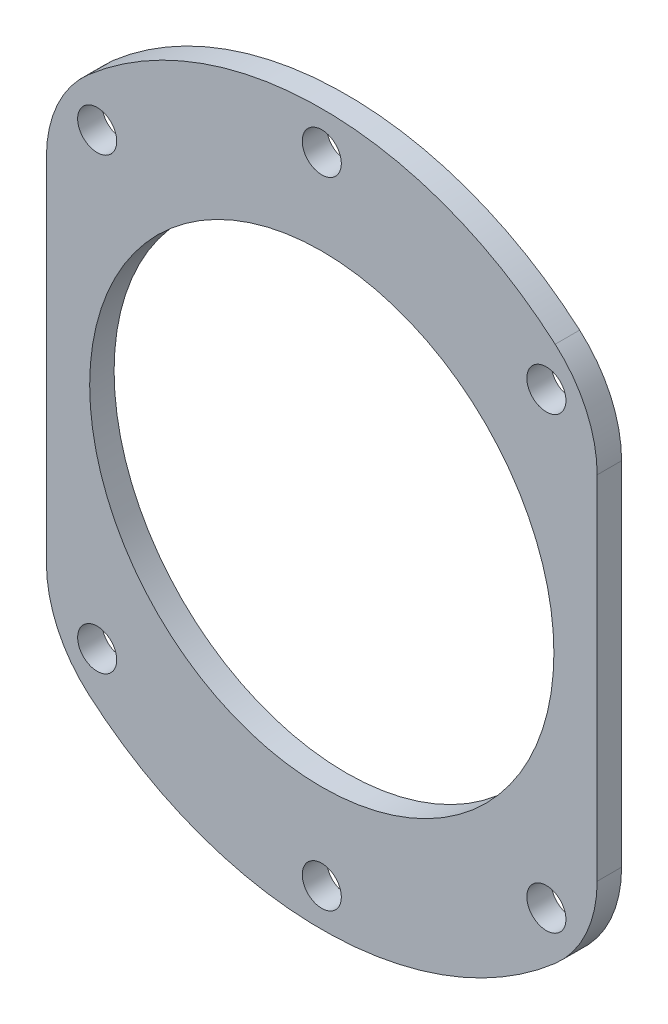
ISO-10303-21;
HEADER;
FILE_DESCRIPTION(('STEP AP214'),'2;1');
FILE_NAME('part.step','',(''),(''),'','','');
FILE_SCHEMA(('AUTOMOTIVE_DESIGN { 1 0 10303 214 1 1 1 1 }'));
ENDSEC;
DATA;
#1=APPLICATION_CONTEXT('core data for automotive mechanical design processes');
#2=APPLICATION_PROTOCOL_DEFINITION('international standard','automotive_design',2000,#1);
#3=PRODUCT_CONTEXT('',#1,'mechanical');
#4=PRODUCT('Part','Part','',(#3));
#5=PRODUCT_RELATED_PRODUCT_CATEGORY('part','',(#4));
#6=PRODUCT_DEFINITION_FORMATION('','',#4);
#7=PRODUCT_DEFINITION_CONTEXT('part definition',#1,'design');
#8=PRODUCT_DEFINITION('design','',#6,#7);
#9=PRODUCT_DEFINITION_SHAPE('','',#8);
#10=(LENGTH_UNIT() NAMED_UNIT(*) SI_UNIT(.MILLI.,.METRE.));
#11=(NAMED_UNIT(*) PLANE_ANGLE_UNIT() SI_UNIT($,.RADIAN.));
#12=(NAMED_UNIT(*) SI_UNIT($,.STERADIAN.) SOLID_ANGLE_UNIT());
#13=UNCERTAINTY_MEASURE_WITH_UNIT(LENGTH_MEASURE(1.E-05),#10,'distance_accuracy_value','');
#14=(GEOMETRIC_REPRESENTATION_CONTEXT(3) GLOBAL_UNCERTAINTY_ASSIGNED_CONTEXT((#13)) GLOBAL_UNIT_ASSIGNED_CONTEXT((#10,
#11,#12)) REPRESENTATION_CONTEXT('',''));
#15=CARTESIAN_POINT('',(0.,0.,0.));
#16=DIRECTION('',(0.,0.,1.));
#17=DIRECTION('',(1.,0.,0.));
#18=AXIS2_PLACEMENT_3D('',#15,#16,#17);
#19=CARTESIAN_POINT('',(-58.8,0.,2.));
#20=DIRECTION('',(0.,0.,1.));
#21=DIRECTION('',(1.,0.,0.));
#22=AXIS2_PLACEMENT_3D('',#19,#20,#21);
#23=PLANE('',#22);
#24=CARTESIAN_POINT('',(-58.8,26.,2.));
#25=DIRECTION('',(0.,0.,1.));
#26=DIRECTION('',(1.,0.,0.));
#27=AXIS2_PLACEMENT_3D('',#24,#25,#26);
#28=CIRCLE('',#27,1.6);
#29=CARTESIAN_POINT('',(-57.2,26.,2.));
#30=VERTEX_POINT('',#29);
#31=EDGE_CURVE('E259',#30,#30,#28,.T.);
#32=ORIENTED_EDGE('',*,*,#31,.F.);
#33=EDGE_LOOP('',(#32));
#34=FACE_BOUND('',#33,.T.);
#35=CARTESIAN_POINT('',(-77.1847763108502,18.3847763108502,2.));
#36=DIRECTION('',(0.,0.,1.));
#37=DIRECTION('',(1.,0.,0.));
#38=AXIS2_PLACEMENT_3D('',#35,#36,#37);
#39=CIRCLE('',#38,1.6);
#40=CARTESIAN_POINT('',(-75.5847763108502,18.3847763108502,2.));
#41=VERTEX_POINT('',#40);
#42=EDGE_CURVE('E233',#41,#41,#39,.T.);
#43=ORIENTED_EDGE('',*,*,#42,.F.);
#44=EDGE_LOOP('',(#43));
#45=FACE_BOUND('',#44,.T.);
#46=CARTESIAN_POINT('',(-77.1847763108502,-18.3847763108502,2.));
#47=DIRECTION('',(0.,0.,1.));
#48=DIRECTION('',(1.,0.,0.));
#49=AXIS2_PLACEMENT_3D('',#46,#47,#48);
#50=CIRCLE('',#49,1.6);
#51=CARTESIAN_POINT('',(-75.5847763108502,-18.3847763108502,2.));
#52=VERTEX_POINT('',#51);
#53=EDGE_CURVE('E232',#52,#52,#50,.T.);
#54=ORIENTED_EDGE('',*,*,#53,.F.);
#55=EDGE_LOOP('',(#54));
#56=FACE_BOUND('',#55,.T.);
#57=CARTESIAN_POINT('',(-58.8,-26.,2.));
#58=DIRECTION('',(0.,0.,1.));
#59=DIRECTION('',(1.,0.,0.));
#60=AXIS2_PLACEMENT_3D('',#57,#58,#59);
#61=CIRCLE('',#60,1.6);
#62=CARTESIAN_POINT('',(-57.2,-26.,2.));
#63=VERTEX_POINT('',#62);
#64=EDGE_CURVE('E241',#63,#63,#61,.T.);
#65=ORIENTED_EDGE('',*,*,#64,.F.);
#66=EDGE_LOOP('',(#65));
#67=FACE_BOUND('',#66,.T.);
#68=CARTESIAN_POINT('',(-40.4152236891498,-18.3847763108502,2.));
#69=DIRECTION('',(0.,0.,1.));
#70=DIRECTION('',(1.,0.,0.));
#71=AXIS2_PLACEMENT_3D('',#68,#69,#70);
#72=CIRCLE('',#71,1.6);
#73=CARTESIAN_POINT('',(-38.8152236891498,-18.3847763108502,2.));
#74=VERTEX_POINT('',#73);
#75=EDGE_CURVE('E248',#74,#74,#72,.T.);
#76=ORIENTED_EDGE('',*,*,#75,.F.);
#77=EDGE_LOOP('',(#76));
#78=FACE_BOUND('',#77,.T.);
#79=CARTESIAN_POINT('',(-40.4152236891497,18.3847763108502,2.));
#80=DIRECTION('',(0.,0.,1.));
#81=DIRECTION('',(1.,0.,0.));
#82=AXIS2_PLACEMENT_3D('',#79,#80,#81);
#83=CIRCLE('',#82,1.59999999999999);
#84=CARTESIAN_POINT('',(-38.8152236891498,18.3847763108502,2.));
#85=VERTEX_POINT('',#84);
#86=EDGE_CURVE('E256',#85,#85,#83,.T.);
#87=ORIENTED_EDGE('',*,*,#86,.F.);
#88=EDGE_LOOP('',(#87));
#89=FACE_BOUND('',#88,.T.);
#90=DIRECTION('',(0.,-1.,0.));
#91=VECTOR('',#90,1.);
#92=CARTESIAN_POINT('',(-81.3413600290393,18.4037248414888,2.));
#93=LINE('',#92,#91);
#94=CARTESIAN_POINT('',(-81.3413600290393,14.4057033365961,2.));
#95=VERTEX_POINT('',#94);
#96=CARTESIAN_POINT('',(-81.3413600290393,-14.4057033365961,2.));
#97=VERTEX_POINT('',#96);
#98=EDGE_CURVE('E158',#95,#97,#93,.T.);
#99=ORIENTED_EDGE('',*,*,#98,.T.);
#100=CARTESIAN_POINT('',(-71.3413600290393,-14.4057033365961,2.));
#101=DIRECTION('',(0.,0.,1.));
#102=DIRECTION('',(1.,0.,0.));
#103=AXIS2_PLACEMENT_3D('',#100,#101,#102);
#104=CIRCLE('',#103,10.);
#105=CARTESIAN_POINT('',(-77.9075171123059,-21.9479563924056,2.));
#106=VERTEX_POINT('',#105);
#107=EDGE_CURVE('E187',#97,#106,#104,.T.);
#108=ORIENTED_EDGE('',*,*,#107,.T.);
#109=CARTESIAN_POINT('',(-58.8,0.,2.));
#110=DIRECTION('',(0.,0.,1.));
#111=DIRECTION('',(1.,0.,0.));
#112=AXIS2_PLACEMENT_3D('',#109,#110,#111);
#113=CIRCLE('',#112,29.1);
#114=CARTESIAN_POINT('',(-39.6924828876942,-21.9479563924057,2.));
#115=VERTEX_POINT('',#114);
#116=EDGE_CURVE('E134',#106,#115,#113,.T.);
#117=ORIENTED_EDGE('',*,*,#116,.T.);
#118=CARTESIAN_POINT('',(-46.2586399709608,-14.4057033365962,2.));
#119=DIRECTION('',(0.,0.,1.));
#120=DIRECTION('',(1.,0.,0.));
#121=AXIS2_PLACEMENT_3D('',#118,#119,#120);
#122=CIRCLE('',#121,10.);
#123=CARTESIAN_POINT('',(-36.2586399709608,-14.4057033365962,2.));
#124=VERTEX_POINT('',#123);
#125=EDGE_CURVE('E181',#115,#124,#122,.T.);
#126=ORIENTED_EDGE('',*,*,#125,.T.);
#127=DIRECTION('',(0.,1.,0.));
#128=VECTOR('',#127,1.);
#129=CARTESIAN_POINT('',(-36.2586399709608,18.4037248414888,2.));
#130=LINE('',#129,#128);
#131=CARTESIAN_POINT('',(-36.2586399709608,14.4057033365962,2.));
#132=VERTEX_POINT('',#131);
#133=EDGE_CURVE('E200',#124,#132,#130,.T.);
#134=ORIENTED_EDGE('',*,*,#133,.T.);
#135=CARTESIAN_POINT('',(-46.2586399709608,14.4057033365962,2.));
#136=DIRECTION('',(0.,0.,1.));
#137=DIRECTION('',(1.,0.,0.));
#138=AXIS2_PLACEMENT_3D('',#135,#136,#137);
#139=CIRCLE('',#138,10.);
#140=CARTESIAN_POINT('',(-39.6924828876942,21.9479563924057,2.));
#141=VERTEX_POINT('',#140);
#142=EDGE_CURVE('E68',#132,#141,#139,.T.);
#143=ORIENTED_EDGE('',*,*,#142,.T.);
#144=CARTESIAN_POINT('',(-58.8,0.,2.));
#145=DIRECTION('',(0.,0.,1.));
#146=DIRECTION('',(1.,0.,0.));
#147=AXIS2_PLACEMENT_3D('',#144,#145,#146);
#148=CIRCLE('',#147,29.1);
#149=CARTESIAN_POINT('',(-77.9075171123059,21.9479563924056,2.));
#150=VERTEX_POINT('',#149);
#151=EDGE_CURVE('E207',#141,#150,#148,.T.);
#152=ORIENTED_EDGE('',*,*,#151,.T.);
#153=CARTESIAN_POINT('',(-71.3413600290393,14.4057033365961,2.));
#154=DIRECTION('',(0.,0.,1.));
#155=DIRECTION('',(1.,0.,0.));
#156=AXIS2_PLACEMENT_3D('',#153,#154,#155);
#157=CIRCLE('',#156,10.);
#158=EDGE_CURVE('E184',#150,#95,#157,.T.);
#159=ORIENTED_EDGE('',*,*,#158,.T.);
#160=EDGE_LOOP('',(#99,#108,#117,#126,#134,#143,#152,#159));
#161=FACE_BOUND('',#160,.T.);
#162=CARTESIAN_POINT('',(-58.8,0.,2.));
#163=DIRECTION('',(0.,0.,1.));
#164=DIRECTION('',(1.,0.,0.));
#165=AXIS2_PLACEMENT_3D('',#162,#163,#164);
#166=CIRCLE('',#165,19.);
#167=CARTESIAN_POINT('',(-39.8,0.,2.));
#168=VERTEX_POINT('',#167);
#169=EDGE_CURVE('E145',#168,#168,#166,.T.);
#170=ORIENTED_EDGE('',*,*,#169,.F.);
#171=EDGE_LOOP('',(#170));
#172=FACE_BOUND('',#171,.T.);
#173=ADVANCED_FACE('F45',(#34,#45,#56,#67,#78,#89,#161,#172),#23,.T.);
#174=CARTESIAN_POINT('',(-58.8,0.,0.));
#175=DIRECTION('',(0.,0.,1.));
#176=DIRECTION('',(1.,0.,0.));
#177=AXIS2_PLACEMENT_3D('',#174,#175,#176);
#178=PLANE('',#177);
#179=CARTESIAN_POINT('',(-58.8,26.,0.));
#180=DIRECTION('',(0.,0.,1.));
#181=DIRECTION('',(1.,0.,0.));
#182=AXIS2_PLACEMENT_3D('',#179,#180,#181);
#183=CIRCLE('',#182,1.6);
#184=CARTESIAN_POINT('',(-57.2,26.,0.));
#185=VERTEX_POINT('',#184);
#186=EDGE_CURVE('E226',#185,#185,#183,.T.);
#187=ORIENTED_EDGE('',*,*,#186,.T.);
#188=EDGE_LOOP('',(#187));
#189=FACE_BOUND('',#188,.T.);
#190=CARTESIAN_POINT('',(-77.1847763108502,18.3847763108502,0.));
#191=DIRECTION('',(0.,0.,1.));
#192=DIRECTION('',(1.,0.,0.));
#193=AXIS2_PLACEMENT_3D('',#190,#191,#192);
#194=CIRCLE('',#193,1.6);
#195=CARTESIAN_POINT('',(-75.5847763108502,18.3847763108502,0.));
#196=VERTEX_POINT('',#195);
#197=EDGE_CURVE('E260',#196,#196,#194,.T.);
#198=ORIENTED_EDGE('',*,*,#197,.T.);
#199=EDGE_LOOP('',(#198));
#200=FACE_BOUND('',#199,.T.);
#201=CARTESIAN_POINT('',(-77.1847763108502,-18.3847763108502,0.));
#202=DIRECTION('',(0.,0.,1.));
#203=DIRECTION('',(1.,0.,0.));
#204=AXIS2_PLACEMENT_3D('',#201,#202,#203);
#205=CIRCLE('',#204,1.6);
#206=CARTESIAN_POINT('',(-75.5847763108502,-18.3847763108502,0.));
#207=VERTEX_POINT('',#206);
#208=EDGE_CURVE('E228',#207,#207,#205,.T.);
#209=ORIENTED_EDGE('',*,*,#208,.T.);
#210=EDGE_LOOP('',(#209));
#211=FACE_BOUND('',#210,.T.);
#212=CARTESIAN_POINT('',(-58.8,-26.,0.));
#213=DIRECTION('',(0.,0.,1.));
#214=DIRECTION('',(1.,0.,0.));
#215=AXIS2_PLACEMENT_3D('',#212,#213,#214);
#216=CIRCLE('',#215,1.6);
#217=CARTESIAN_POINT('',(-57.2,-26.,0.));
#218=VERTEX_POINT('',#217);
#219=EDGE_CURVE('E237',#218,#218,#216,.T.);
#220=ORIENTED_EDGE('',*,*,#219,.T.);
#221=EDGE_LOOP('',(#220));
#222=FACE_BOUND('',#221,.T.);
#223=CARTESIAN_POINT('',(-40.4152236891498,-18.3847763108502,0.));
#224=DIRECTION('',(0.,0.,1.));
#225=DIRECTION('',(1.,0.,0.));
#226=AXIS2_PLACEMENT_3D('',#223,#224,#225);
#227=CIRCLE('',#226,1.6);
#228=CARTESIAN_POINT('',(-38.8152236891498,-18.3847763108502,0.));
#229=VERTEX_POINT('',#228);
#230=EDGE_CURVE('E245',#229,#229,#227,.T.);
#231=ORIENTED_EDGE('',*,*,#230,.T.);
#232=EDGE_LOOP('',(#231));
#233=FACE_BOUND('',#232,.T.);
#234=CARTESIAN_POINT('',(-40.4152236891497,18.3847763108502,0.));
#235=DIRECTION('',(0.,0.,1.));
#236=DIRECTION('',(1.,0.,0.));
#237=AXIS2_PLACEMENT_3D('',#234,#235,#236);
#238=CIRCLE('',#237,1.59999999999999);
#239=CARTESIAN_POINT('',(-38.8152236891498,18.3847763108502,0.));
#240=VERTEX_POINT('',#239);
#241=EDGE_CURVE('E252',#240,#240,#238,.T.);
#242=ORIENTED_EDGE('',*,*,#241,.T.);
#243=EDGE_LOOP('',(#242));
#244=FACE_BOUND('',#243,.T.);
#245=CARTESIAN_POINT('',(-58.8,0.,0.));
#246=DIRECTION('',(0.,0.,1.));
#247=DIRECTION('',(1.,0.,0.));
#248=AXIS2_PLACEMENT_3D('',#245,#246,#247);
#249=CIRCLE('',#248,29.1);
#250=CARTESIAN_POINT('',(-77.9075171123059,-21.9479563924056,0.));
#251=VERTEX_POINT('',#250);
#252=CARTESIAN_POINT('',(-39.6924828876942,-21.9479563924057,0.));
#253=VERTEX_POINT('',#252);
#254=EDGE_CURVE('E131',#251,#253,#249,.T.);
#255=ORIENTED_EDGE('',*,*,#254,.F.);
#256=CARTESIAN_POINT('',(-71.3413600290393,-14.4057033365961,0.));
#257=DIRECTION('',(0.,0.,1.));
#258=DIRECTION('',(1.,0.,0.));
#259=AXIS2_PLACEMENT_3D('',#256,#257,#258);
#260=CIRCLE('',#259,10.);
#261=CARTESIAN_POINT('',(-81.3413600290393,-14.4057033365961,0.));
#262=VERTEX_POINT('',#261);
#263=EDGE_CURVE('E113',#251,#262,#260,.F.);
#264=ORIENTED_EDGE('',*,*,#263,.T.);
#265=DIRECTION('',(0.,-1.,0.));
#266=VECTOR('',#265,1.);
#267=CARTESIAN_POINT('',(-81.3413600290393,18.4037248414888,0.));
#268=LINE('',#267,#266);
#269=CARTESIAN_POINT('',(-81.3413600290393,14.4057033365961,0.));
#270=VERTEX_POINT('',#269);
#271=EDGE_CURVE('E163',#270,#262,#268,.T.);
#272=ORIENTED_EDGE('',*,*,#271,.F.);
#273=CARTESIAN_POINT('',(-71.3413600290393,14.4057033365961,0.));
#274=DIRECTION('',(0.,0.,1.));
#275=DIRECTION('',(1.,0.,0.));
#276=AXIS2_PLACEMENT_3D('',#273,#274,#275);
#277=CIRCLE('',#276,10.);
#278=CARTESIAN_POINT('',(-77.9075171123059,21.9479563924056,0.));
#279=VERTEX_POINT('',#278);
#280=EDGE_CURVE('E125',#270,#279,#277,.F.);
#281=ORIENTED_EDGE('',*,*,#280,.T.);
#282=CARTESIAN_POINT('',(-58.8,0.,0.));
#283=DIRECTION('',(0.,0.,1.));
#284=DIRECTION('',(1.,0.,0.));
#285=AXIS2_PLACEMENT_3D('',#282,#283,#284);
#286=CIRCLE('',#285,29.1);
#287=CARTESIAN_POINT('',(-39.6924828876942,21.9479563924057,0.));
#288=VERTEX_POINT('',#287);
#289=EDGE_CURVE('E151',#288,#279,#286,.T.);
#290=ORIENTED_EDGE('',*,*,#289,.F.);
#291=CARTESIAN_POINT('',(-46.2586399709608,14.4057033365962,0.));
#292=DIRECTION('',(0.,0.,1.));
#293=DIRECTION('',(1.,0.,0.));
#294=AXIS2_PLACEMENT_3D('',#291,#292,#293);
#295=CIRCLE('',#294,10.);
#296=CARTESIAN_POINT('',(-36.2586399709608,14.4057033365962,0.));
#297=VERTEX_POINT('',#296);
#298=EDGE_CURVE('E136',#288,#297,#295,.F.);
#299=ORIENTED_EDGE('',*,*,#298,.T.);
#300=DIRECTION('',(0.,1.,0.));
#301=VECTOR('',#300,1.);
#302=CARTESIAN_POINT('',(-36.2586399709608,18.4037248414888,0.));
#303=LINE('',#302,#301);
#304=CARTESIAN_POINT('',(-36.2586399709608,-14.4057033365962,0.));
#305=VERTEX_POINT('',#304);
#306=EDGE_CURVE('E144',#305,#297,#303,.T.);
#307=ORIENTED_EDGE('',*,*,#306,.F.);
#308=CARTESIAN_POINT('',(-46.2586399709608,-14.4057033365962,0.));
#309=DIRECTION('',(0.,0.,1.));
#310=DIRECTION('',(1.,0.,0.));
#311=AXIS2_PLACEMENT_3D('',#308,#309,#310);
#312=CIRCLE('',#311,10.);
#313=EDGE_CURVE('E142',#305,#253,#312,.F.);
#314=ORIENTED_EDGE('',*,*,#313,.T.);
#315=EDGE_LOOP('',(#255,#264,#272,#281,#290,#299,#307,#314));
#316=FACE_BOUND('',#315,.T.);
#317=CARTESIAN_POINT('',(-58.8,0.,0.));
#318=DIRECTION('',(0.,0.,1.));
#319=DIRECTION('',(1.,0.,0.));
#320=AXIS2_PLACEMENT_3D('',#317,#318,#319);
#321=CIRCLE('',#320,19.);
#322=CARTESIAN_POINT('',(-39.8,0.,0.));
#323=VERTEX_POINT('',#322);
#324=EDGE_CURVE('E155',#323,#323,#321,.T.);
#325=ORIENTED_EDGE('',*,*,#324,.T.);
#326=EDGE_LOOP('',(#325));
#327=FACE_BOUND('',#326,.T.);
#328=ADVANCED_FACE('F139',(#189,#200,#211,#222,#233,#244,#316,#327),#178,.F.);
#329=CARTESIAN_POINT('',(-58.8,0.,2.));
#330=DIRECTION('',(0.,0.,-1.));
#331=DIRECTION('',(-1.,0.,0.));
#332=AXIS2_PLACEMENT_3D('',#329,#330,#331);
#333=CYLINDRICAL_SURFACE('',#332,29.1);
#334=ORIENTED_EDGE('',*,*,#116,.F.);
#335=DIRECTION('',(0.,0.,-1.));
#336=VECTOR('',#335,1.);
#337=CARTESIAN_POINT('',(-77.9075171123059,-21.9479563924056,2.));
#338=LINE('',#337,#336);
#339=EDGE_CURVE('E117',#106,#251,#338,.T.);
#340=ORIENTED_EDGE('',*,*,#339,.T.);
#341=ORIENTED_EDGE('',*,*,#254,.T.);
#342=DIRECTION('',(0.,0.,-1.));
#343=VECTOR('',#342,1.);
#344=CARTESIAN_POINT('',(-39.6924828876942,-21.9479563924057,2.));
#345=LINE('',#344,#343);
#346=EDGE_CURVE('E137',#253,#115,#345,.F.);
#347=ORIENTED_EDGE('',*,*,#346,.T.);
#348=EDGE_LOOP('',(#334,#340,#341,#347));
#349=FACE_BOUND('',#348,.T.);
#350=ADVANCED_FACE('F130',(#349),#333,.T.);
#351=CARTESIAN_POINT('',(-36.2586399709608,18.4037248414888,2.));
#352=DIRECTION('',(-1.,0.,0.));
#353=DIRECTION('',(0.,0.,1.));
#354=AXIS2_PLACEMENT_3D('',#351,#352,#353);
#355=PLANE('',#354);
#356=ORIENTED_EDGE('',*,*,#133,.F.);
#357=DIRECTION('',(0.,0.,-1.));
#358=VECTOR('',#357,1.);
#359=CARTESIAN_POINT('',(-36.2586399709608,-14.4057033365962,2.));
#360=LINE('',#359,#358);
#361=EDGE_CURVE('E11',#124,#305,#360,.T.);
#362=ORIENTED_EDGE('',*,*,#361,.T.);
#363=ORIENTED_EDGE('',*,*,#306,.T.);
#364=DIRECTION('',(0.,0.,-1.));
#365=VECTOR('',#364,1.);
#366=CARTESIAN_POINT('',(-36.2586399709608,14.4057033365962,2.));
#367=LINE('',#366,#365);
#368=EDGE_CURVE('E54',#297,#132,#367,.F.);
#369=ORIENTED_EDGE('',*,*,#368,.T.);
#370=EDGE_LOOP('',(#356,#362,#363,#369));
#371=FACE_BOUND('',#370,.T.);
#372=ADVANCED_FACE('F199',(#371),#355,.F.);
#373=CARTESIAN_POINT('',(-58.8,0.,2.));
#374=DIRECTION('',(0.,0.,-1.));
#375=DIRECTION('',(-1.,0.,0.));
#376=AXIS2_PLACEMENT_3D('',#373,#374,#375);
#377=CYLINDRICAL_SURFACE('',#376,29.1);
#378=ORIENTED_EDGE('',*,*,#289,.T.);
#379=DIRECTION('',(0.,0.,-1.));
#380=VECTOR('',#379,1.);
#381=CARTESIAN_POINT('',(-77.9075171123059,21.9479563924056,2.));
#382=LINE('',#381,#380);
#383=EDGE_CURVE('E61',#279,#150,#382,.F.);
#384=ORIENTED_EDGE('',*,*,#383,.T.);
#385=ORIENTED_EDGE('',*,*,#151,.F.);
#386=DIRECTION('',(0.,0.,-1.));
#387=VECTOR('',#386,1.);
#388=CARTESIAN_POINT('',(-39.6924828876942,21.9479563924057,2.));
#389=LINE('',#388,#387);
#390=EDGE_CURVE('E190',#141,#288,#389,.T.);
#391=ORIENTED_EDGE('',*,*,#390,.T.);
#392=EDGE_LOOP('',(#378,#384,#385,#391));
#393=FACE_BOUND('',#392,.T.);
#394=ADVANCED_FACE('F211',(#393),#377,.T.);
#395=CARTESIAN_POINT('',(-81.3413600290393,18.4037248414888,2.));
#396=DIRECTION('',(1.,0.,0.));
#397=DIRECTION('',(0.,0.,-1.));
#398=AXIS2_PLACEMENT_3D('',#395,#396,#397);
#399=PLANE('',#398);
#400=ORIENTED_EDGE('',*,*,#271,.T.);
#401=DIRECTION('',(0.,0.,-1.));
#402=VECTOR('',#401,1.);
#403=CARTESIAN_POINT('',(-81.3413600290393,-14.4057033365961,2.));
#404=LINE('',#403,#402);
#405=EDGE_CURVE('E118',#262,#97,#404,.F.);
#406=ORIENTED_EDGE('',*,*,#405,.T.);
#407=ORIENTED_EDGE('',*,*,#98,.F.);
#408=DIRECTION('',(0.,0.,-1.));
#409=VECTOR('',#408,1.);
#410=CARTESIAN_POINT('',(-81.3413600290393,14.4057033365961,2.));
#411=LINE('',#410,#409);
#412=EDGE_CURVE('E124',#95,#270,#411,.T.);
#413=ORIENTED_EDGE('',*,*,#412,.T.);
#414=EDGE_LOOP('',(#400,#406,#407,#413));
#415=FACE_BOUND('',#414,.T.);
#416=ADVANCED_FACE('F218',(#415),#399,.F.);
#417=CARTESIAN_POINT('',(-58.8,0.,2.));
#418=DIRECTION('',(0.,0.,-1.));
#419=DIRECTION('',(-1.,0.,0.));
#420=AXIS2_PLACEMENT_3D('',#417,#418,#419);
#421=CYLINDRICAL_SURFACE('',#420,19.);
#422=ORIENTED_EDGE('',*,*,#169,.T.);
#423=EDGE_LOOP('',(#422));
#424=FACE_BOUND('',#423,.T.);
#425=ORIENTED_EDGE('',*,*,#324,.F.);
#426=EDGE_LOOP('',(#425));
#427=FACE_BOUND('',#426,.T.);
#428=ADVANCED_FACE('F299',(#424,#427),#421,.F.);
#429=CARTESIAN_POINT('',(-40.4152236891497,18.3847763108502,0.));
#430=DIRECTION('',(0.,0.,1.));
#431=DIRECTION('',(1.,0.,0.));
#432=AXIS2_PLACEMENT_3D('',#429,#430,#431);
#433=CYLINDRICAL_SURFACE('',#432,1.59999999999999);
#434=ORIENTED_EDGE('',*,*,#241,.F.);
#435=EDGE_LOOP('',(#434));
#436=FACE_BOUND('',#435,.T.);
#437=ORIENTED_EDGE('',*,*,#86,.T.);
#438=EDGE_LOOP('',(#437));
#439=FACE_BOUND('',#438,.T.);
#440=ADVANCED_FACE('F296',(#436,#439),#433,.F.);
#441=CARTESIAN_POINT('',(-40.4152236891498,-18.3847763108502,0.));
#442=DIRECTION('',(0.,0.,1.));
#443=DIRECTION('',(1.,0.,0.));
#444=AXIS2_PLACEMENT_3D('',#441,#442,#443);
#445=CYLINDRICAL_SURFACE('',#444,1.6);
#446=ORIENTED_EDGE('',*,*,#230,.F.);
#447=EDGE_LOOP('',(#446));
#448=FACE_BOUND('',#447,.T.);
#449=ORIENTED_EDGE('',*,*,#75,.T.);
#450=EDGE_LOOP('',(#449));
#451=FACE_BOUND('',#450,.T.);
#452=ADVANCED_FACE('F298',(#448,#451),#445,.F.);
#453=CARTESIAN_POINT('',(-58.8,-26.,0.));
#454=DIRECTION('',(0.,0.,1.));
#455=DIRECTION('',(1.,0.,0.));
#456=AXIS2_PLACEMENT_3D('',#453,#454,#455);
#457=CYLINDRICAL_SURFACE('',#456,1.6);
#458=ORIENTED_EDGE('',*,*,#219,.F.);
#459=EDGE_LOOP('',(#458));
#460=FACE_BOUND('',#459,.T.);
#461=ORIENTED_EDGE('',*,*,#64,.T.);
#462=EDGE_LOOP('',(#461));
#463=FACE_BOUND('',#462,.T.);
#464=ADVANCED_FACE('F306',(#460,#463),#457,.F.);
#465=CARTESIAN_POINT('',(-77.1847763108502,-18.3847763108502,0.));
#466=DIRECTION('',(0.,0.,1.));
#467=DIRECTION('',(1.,0.,0.));
#468=AXIS2_PLACEMENT_3D('',#465,#466,#467);
#469=CYLINDRICAL_SURFACE('',#468,1.6);
#470=ORIENTED_EDGE('',*,*,#208,.F.);
#471=EDGE_LOOP('',(#470));
#472=FACE_BOUND('',#471,.T.);
#473=ORIENTED_EDGE('',*,*,#53,.T.);
#474=EDGE_LOOP('',(#473));
#475=FACE_BOUND('',#474,.T.);
#476=ADVANCED_FACE('F316',(#472,#475),#469,.F.);
#477=CARTESIAN_POINT('',(-77.1847763108502,18.3847763108502,0.));
#478=DIRECTION('',(0.,0.,1.));
#479=DIRECTION('',(1.,0.,0.));
#480=AXIS2_PLACEMENT_3D('',#477,#478,#479);
#481=CYLINDRICAL_SURFACE('',#480,1.6);
#482=ORIENTED_EDGE('',*,*,#197,.F.);
#483=EDGE_LOOP('',(#482));
#484=FACE_BOUND('',#483,.T.);
#485=ORIENTED_EDGE('',*,*,#42,.T.);
#486=EDGE_LOOP('',(#485));
#487=FACE_BOUND('',#486,.T.);
#488=ADVANCED_FACE('F279',(#484,#487),#481,.F.);
#489=CARTESIAN_POINT('',(-58.8,26.,0.));
#490=DIRECTION('',(0.,0.,1.));
#491=DIRECTION('',(1.,0.,0.));
#492=AXIS2_PLACEMENT_3D('',#489,#490,#491);
#493=CYLINDRICAL_SURFACE('',#492,1.6);
#494=ORIENTED_EDGE('',*,*,#186,.F.);
#495=EDGE_LOOP('',(#494));
#496=FACE_BOUND('',#495,.T.);
#497=ORIENTED_EDGE('',*,*,#31,.T.);
#498=EDGE_LOOP('',(#497));
#499=FACE_BOUND('',#498,.T.);
#500=ADVANCED_FACE('F276',(#496,#499),#493,.F.);
#501=CARTESIAN_POINT('',(-71.3413600290393,-14.4057033365961,2.));
#502=DIRECTION('',(0.,0.,-1.));
#503=DIRECTION('',(-1.,0.,0.));
#504=AXIS2_PLACEMENT_3D('',#501,#502,#503);
#505=CYLINDRICAL_SURFACE('',#504,10.);
#506=ORIENTED_EDGE('',*,*,#107,.F.);
#507=ORIENTED_EDGE('',*,*,#405,.F.);
#508=ORIENTED_EDGE('',*,*,#263,.F.);
#509=ORIENTED_EDGE('',*,*,#339,.F.);
#510=EDGE_LOOP('',(#506,#507,#508,#509));
#511=FACE_BOUND('',#510,.T.);
#512=ADVANCED_FACE('F116',(#511),#505,.T.);
#513=CARTESIAN_POINT('',(-71.3413600290393,14.4057033365961,2.));
#514=DIRECTION('',(0.,0.,-1.));
#515=DIRECTION('',(-1.,0.,0.));
#516=AXIS2_PLACEMENT_3D('',#513,#514,#515);
#517=CYLINDRICAL_SURFACE('',#516,10.);
#518=ORIENTED_EDGE('',*,*,#158,.F.);
#519=ORIENTED_EDGE('',*,*,#383,.F.);
#520=ORIENTED_EDGE('',*,*,#280,.F.);
#521=ORIENTED_EDGE('',*,*,#412,.F.);
#522=EDGE_LOOP('',(#518,#519,#520,#521));
#523=FACE_BOUND('',#522,.T.);
#524=ADVANCED_FACE('F215',(#523),#517,.T.);
#525=CARTESIAN_POINT('',(-46.2586399709608,-14.4057033365962,2.));
#526=DIRECTION('',(0.,0.,-1.));
#527=DIRECTION('',(-1.,0.,0.));
#528=AXIS2_PLACEMENT_3D('',#525,#526,#527);
#529=CYLINDRICAL_SURFACE('',#528,10.);
#530=ORIENTED_EDGE('',*,*,#125,.F.);
#531=ORIENTED_EDGE('',*,*,#346,.F.);
#532=ORIENTED_EDGE('',*,*,#313,.F.);
#533=ORIENTED_EDGE('',*,*,#361,.F.);
#534=EDGE_LOOP('',(#530,#531,#532,#533));
#535=FACE_BOUND('',#534,.T.);
#536=ADVANCED_FACE('F334',(#535),#529,.T.);
#537=CARTESIAN_POINT('',(-46.2586399709608,14.4057033365962,2.));
#538=DIRECTION('',(0.,0.,-1.));
#539=DIRECTION('',(-1.,0.,0.));
#540=AXIS2_PLACEMENT_3D('',#537,#538,#539);
#541=CYLINDRICAL_SURFACE('',#540,10.);
#542=ORIENTED_EDGE('',*,*,#142,.F.);
#543=ORIENTED_EDGE('',*,*,#368,.F.);
#544=ORIENTED_EDGE('',*,*,#298,.F.);
#545=ORIENTED_EDGE('',*,*,#390,.F.);
#546=EDGE_LOOP('',(#542,#543,#544,#545));
#547=FACE_BOUND('',#546,.T.);
#548=ADVANCED_FACE('F47',(#547),#541,.T.);
#549=CLOSED_SHELL('',(#173,#328,#350,#372,#394,#416,#428,#440,#452,#464,#476,#488,#500,#512,
#524,#536,#548));
#550=MANIFOLD_SOLID_BREP('B2',#549);
#551=ADVANCED_BREP_SHAPE_REPRESENTATION('',(#18,#550),#14);
#552=SHAPE_DEFINITION_REPRESENTATION(#9,#551);
ENDSEC;
END-ISO-10303-21;
